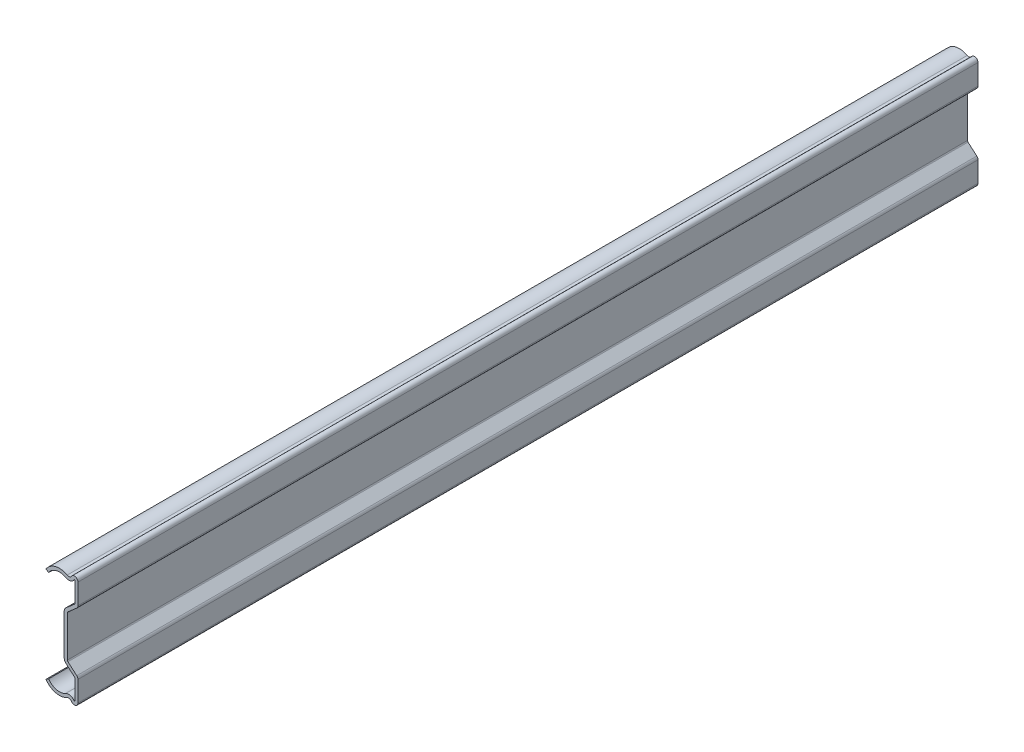
ISO-10303-21;
HEADER;
FILE_DESCRIPTION(('STEP AP214'),'2;1');
FILE_NAME('part.step','',(''),(''),'','','');
FILE_SCHEMA(('AUTOMOTIVE_DESIGN { 1 0 10303 214 1 1 1 1 }'));
ENDSEC;
DATA;
#1=APPLICATION_CONTEXT('core data for automotive mechanical design processes');
#2=APPLICATION_PROTOCOL_DEFINITION('international standard','automotive_design',2000,#1);
#3=PRODUCT_CONTEXT('',#1,'mechanical');
#4=PRODUCT('Part','Part','',(#3));
#5=PRODUCT_RELATED_PRODUCT_CATEGORY('part','',(#4));
#6=PRODUCT_DEFINITION_FORMATION('','',#4);
#7=PRODUCT_DEFINITION_CONTEXT('part definition',#1,'design');
#8=PRODUCT_DEFINITION('design','',#6,#7);
#9=PRODUCT_DEFINITION_SHAPE('','',#8);
#10=(LENGTH_UNIT() NAMED_UNIT(*) SI_UNIT(.MILLI.,.METRE.));
#11=(NAMED_UNIT(*) PLANE_ANGLE_UNIT() SI_UNIT($,.RADIAN.));
#12=(NAMED_UNIT(*) SI_UNIT($,.STERADIAN.) SOLID_ANGLE_UNIT());
#13=UNCERTAINTY_MEASURE_WITH_UNIT(LENGTH_MEASURE(1.E-05),#10,'distance_accuracy_value','');
#14=(GEOMETRIC_REPRESENTATION_CONTEXT(3) GLOBAL_UNCERTAINTY_ASSIGNED_CONTEXT((#13)) GLOBAL_UNIT_ASSIGNED_CONTEXT((#10,
#11,#12)) REPRESENTATION_CONTEXT('',''));
#15=CARTESIAN_POINT('',(0.,0.,0.));
#16=DIRECTION('',(0.,0.,1.));
#17=DIRECTION('',(1.,0.,0.));
#18=AXIS2_PLACEMENT_3D('',#15,#16,#17);
#19=CARTESIAN_POINT('',(-4.393139347672,-17.49300104292,-137.));
#20=DIRECTION('',(0.,0.,1.));
#21=DIRECTION('',(1.,0.,0.));
#22=AXIS2_PLACEMENT_3D('',#19,#20,#21);
#23=CYLINDRICAL_SURFACE('',#22,1.);
#24=CARTESIAN_POINT('',(-4.393139347672,-17.49300104292,145.));
#25=DIRECTION('',(0.,0.,1.));
#26=DIRECTION('',(1.,0.,0.));
#27=AXIS2_PLACEMENT_3D('',#24,#25,#26);
#28=CIRCLE('',#27,1.);
#29=CARTESIAN_POINT('',(-4.87936460593729,-16.619167535768,145.));
#30=VERTEX_POINT('',#29);
#31=CARTESIAN_POINT('',(-3.53926346782714,-16.972524355817,145.));
#32=VERTEX_POINT('',#31);
#33=EDGE_CURVE('E219',#30,#32,#28,.F.);
#34=ORIENTED_EDGE('',*,*,#33,.F.);
#35=DIRECTION('',(0.,0.,1.));
#36=VECTOR('',#35,1.);
#37=CARTESIAN_POINT('',(-4.87936460593715,-16.6191675357697,-137.));
#38=LINE('',#37,#36);
#39=CARTESIAN_POINT('',(-4.87936460593729,-16.619167535768,-137.));
#40=VERTEX_POINT('',#39);
#41=EDGE_CURVE('E221',#40,#30,#38,.T.);
#42=ORIENTED_EDGE('',*,*,#41,.F.);
#43=CARTESIAN_POINT('',(-4.393139347672,-17.49300104292,-137.));
#44=DIRECTION('',(0.,0.,1.));
#45=DIRECTION('',(1.,0.,0.));
#46=AXIS2_PLACEMENT_3D('',#43,#44,#45);
#47=CIRCLE('',#46,1.);
#48=CARTESIAN_POINT('',(-3.53926346782714,-16.972524355817,-137.));
#49=VERTEX_POINT('',#48);
#50=EDGE_CURVE('E21',#49,#40,#47,.T.);
#51=ORIENTED_EDGE('',*,*,#50,.F.);
#52=DIRECTION('',(0.,0.,1.));
#53=VECTOR('',#52,1.);
#54=CARTESIAN_POINT('',(-3.53926346782668,-16.9725243558192,-137.));
#55=LINE('',#54,#53);
#56=EDGE_CURVE('E314',#32,#49,#55,.F.);
#57=ORIENTED_EDGE('',*,*,#56,.F.);
#58=EDGE_LOOP('',(#34,#42,#51,#57));
#59=FACE_BOUND('',#58,.T.);
#60=ADVANCED_FACE('F17',(#59),#23,.F.);
#61=CARTESIAN_POINT('',(-2.6,-10.,-137.));
#62=DIRECTION('',(0.,0.,1.));
#63=DIRECTION('',(1.,0.,0.));
#64=AXIS2_PLACEMENT_3D('',#61,#62,#63);
#65=CYLINDRICAL_SURFACE('',#64,1.1);
#66=DIRECTION('',(0.,0.,-1.));
#67=VECTOR('',#66,1.);
#68=CARTESIAN_POINT('',(-1.5,-10.,-137.));
#69=LINE('',#68,#67);
#70=CARTESIAN_POINT('',(-1.5,-10.,-137.));
#71=VERTEX_POINT('',#70);
#72=CARTESIAN_POINT('',(-1.5,-10.,145.));
#73=VERTEX_POINT('',#72);
#74=EDGE_CURVE('E316',#71,#73,#69,.F.);
#75=ORIENTED_EDGE('',*,*,#74,.F.);
#76=CARTESIAN_POINT('',(-2.6,-10.,-137.));
#77=DIRECTION('',(0.,0.,1.));
#78=DIRECTION('',(1.,0.,0.));
#79=AXIS2_PLACEMENT_3D('',#76,#77,#78);
#80=CIRCLE('',#79,1.1);
#81=CARTESIAN_POINT('',(-1.87795841654408,-9.17014703003493,-137.));
#82=VERTEX_POINT('',#81);
#83=EDGE_CURVE('E307',#71,#82,#80,.T.);
#84=ORIENTED_EDGE('',*,*,#83,.T.);
#85=DIRECTION('',(0.,0.,1.));
#86=VECTOR('',#85,1.);
#87=CARTESIAN_POINT('',(-1.877958416544,-9.170147030035,-137.));
#88=LINE('',#87,#86);
#89=CARTESIAN_POINT('',(-1.87795841654408,-9.17014703003493,145.));
#90=VERTEX_POINT('',#89);
#91=EDGE_CURVE('E324',#90,#82,#88,.F.);
#92=ORIENTED_EDGE('',*,*,#91,.F.);
#93=CARTESIAN_POINT('',(-2.6,-10.,145.));
#94=DIRECTION('',(0.,0.,1.));
#95=DIRECTION('',(1.,0.,0.));
#96=AXIS2_PLACEMENT_3D('',#93,#94,#95);
#97=CIRCLE('',#96,1.1);
#98=EDGE_CURVE('E309',#90,#73,#97,.F.);
#99=ORIENTED_EDGE('',*,*,#98,.T.);
#100=EDGE_LOOP('',(#75,#84,#92,#99));
#101=FACE_BOUND('',#100,.T.);
#102=ADVANCED_FACE('F724',(#101),#65,.T.);
#103=CARTESIAN_POINT('',(-2.6,10.,-137.));
#104=DIRECTION('',(0.,0.,1.));
#105=DIRECTION('',(1.,0.,0.));
#106=AXIS2_PLACEMENT_3D('',#103,#104,#105);
#107=CYLINDRICAL_SURFACE('',#106,1.1);
#108=DIRECTION('',(0.,0.,1.));
#109=VECTOR('',#108,1.);
#110=CARTESIAN_POINT('',(-1.87795841654404,9.17014703003505,-137.));
#111=LINE('',#110,#109);
#112=CARTESIAN_POINT('',(-1.8779584165441,9.17014703003495,-137.));
#113=VERTEX_POINT('',#112);
#114=CARTESIAN_POINT('',(-1.8779584165441,9.17014703003495,145.));
#115=VERTEX_POINT('',#114);
#116=EDGE_CURVE('E434',#113,#115,#111,.T.);
#117=ORIENTED_EDGE('',*,*,#116,.F.);
#118=CARTESIAN_POINT('',(-2.6,10.,-137.));
#119=DIRECTION('',(0.,0.,1.));
#120=DIRECTION('',(1.,0.,0.));
#121=AXIS2_PLACEMENT_3D('',#118,#119,#120);
#122=CIRCLE('',#121,1.1);
#123=CARTESIAN_POINT('',(-1.5,10.,-137.));
#124=VERTEX_POINT('',#123);
#125=EDGE_CURVE('E303',#113,#124,#122,.T.);
#126=ORIENTED_EDGE('',*,*,#125,.T.);
#127=DIRECTION('',(0.,0.,-1.));
#128=VECTOR('',#127,1.);
#129=CARTESIAN_POINT('',(-1.5,10.,-137.));
#130=LINE('',#129,#128);
#131=CARTESIAN_POINT('',(-1.5,10.,145.));
#132=VERTEX_POINT('',#131);
#133=EDGE_CURVE('E431',#132,#124,#130,.T.);
#134=ORIENTED_EDGE('',*,*,#133,.F.);
#135=CARTESIAN_POINT('',(-2.6,10.,145.));
#136=DIRECTION('',(0.,0.,1.));
#137=DIRECTION('',(1.,0.,0.));
#138=AXIS2_PLACEMENT_3D('',#135,#136,#137);
#139=CIRCLE('',#138,1.1);
#140=EDGE_CURVE('E305',#132,#115,#139,.F.);
#141=ORIENTED_EDGE('',*,*,#140,.T.);
#142=EDGE_LOOP('',(#117,#126,#134,#141));
#143=FACE_BOUND('',#142,.T.);
#144=ADVANCED_FACE('F716',(#143),#107,.T.);
#145=CARTESIAN_POINT('',(-4.393139347672,17.49300104292,-137.));
#146=DIRECTION('',(0.,0.,1.));
#147=DIRECTION('',(1.,0.,0.));
#148=AXIS2_PLACEMENT_3D('',#145,#146,#147);
#149=CYLINDRICAL_SURFACE('',#148,1.);
#150=CARTESIAN_POINT('',(-4.393139347672,17.49300104292,145.));
#151=DIRECTION('',(0.,0.,1.));
#152=DIRECTION('',(1.,0.,0.));
#153=AXIS2_PLACEMENT_3D('',#150,#151,#152);
#154=CIRCLE('',#153,1.);
#155=CARTESIAN_POINT('',(-3.53926346782714,16.972524355817,145.));
#156=VERTEX_POINT('',#155);
#157=CARTESIAN_POINT('',(-4.87936460593729,16.619167535768,145.));
#158=VERTEX_POINT('',#157);
#159=EDGE_CURVE('E298',#156,#158,#154,.F.);
#160=ORIENTED_EDGE('',*,*,#159,.F.);
#161=DIRECTION('',(0.,0.,1.));
#162=VECTOR('',#161,1.);
#163=CARTESIAN_POINT('',(-3.53926346782668,16.9725243558192,-137.));
#164=LINE('',#163,#162);
#165=CARTESIAN_POINT('',(-3.53926346782714,16.972524355817,-137.));
#166=VERTEX_POINT('',#165);
#167=EDGE_CURVE('E428',#166,#156,#164,.T.);
#168=ORIENTED_EDGE('',*,*,#167,.F.);
#169=CARTESIAN_POINT('',(-4.393139347672,17.49300104292,-137.));
#170=DIRECTION('',(0.,0.,1.));
#171=DIRECTION('',(1.,0.,0.));
#172=AXIS2_PLACEMENT_3D('',#169,#170,#171);
#173=CIRCLE('',#172,1.);
#174=CARTESIAN_POINT('',(-4.87936460593729,16.619167535768,-137.));
#175=VERTEX_POINT('',#174);
#176=EDGE_CURVE('E301',#175,#166,#173,.T.);
#177=ORIENTED_EDGE('',*,*,#176,.F.);
#178=DIRECTION('',(0.,0.,1.));
#179=VECTOR('',#178,1.);
#180=CARTESIAN_POINT('',(-4.87936460593715,16.6191675357697,-137.));
#181=LINE('',#180,#179);
#182=EDGE_CURVE('E419',#158,#175,#181,.F.);
#183=ORIENTED_EDGE('',*,*,#182,.F.);
#184=EDGE_LOOP('',(#160,#168,#177,#183));
#185=FACE_BOUND('',#184,.T.);
#186=ADVANCED_FACE('F708',(#185),#149,.F.);
#187=CARTESIAN_POINT('',(-11.51049089726,14.96293199325,-137.));
#188=DIRECTION('',(-0.542586398650006,-0.84000000000001,0.));
#189=DIRECTION('',(0.84000000000001,-0.542586398650006,0.));
#190=AXIS2_PLACEMENT_3D('',#187,#188,#189);
#191=PLANE('',#190);
#192=DIRECTION('',(0.,0.,1.));
#193=VECTOR('',#192,1.);
#194=CARTESIAN_POINT('',(-11.5104908972622,14.9629319932514,-137.));
#195=LINE('',#194,#193);
#196=CARTESIAN_POINT('',(-11.5104908972622,14.9629319932514,-137.));
#197=VERTEX_POINT('',#196);
#198=CARTESIAN_POINT('',(-11.5104908972622,14.9629319932514,145.));
#199=VERTEX_POINT('',#198);
#200=EDGE_CURVE('E422',#197,#199,#195,.T.);
#201=ORIENTED_EDGE('',*,*,#200,.F.);
#202=DIRECTION('',(0.84000000000001,-0.542586398650006,0.));
#203=VECTOR('',#202,1.);
#204=CARTESIAN_POINT('',(-11.51049089726,14.96293199325,-137.));
#205=LINE('',#204,#203);
#206=CARTESIAN_POINT('',(-10.6704908972622,14.4203455946014,-137.));
#207=VERTEX_POINT('',#206);
#208=EDGE_CURVE('E297',#197,#207,#205,.T.);
#209=ORIENTED_EDGE('',*,*,#208,.T.);
#210=DIRECTION('',(0.,0.,1.));
#211=VECTOR('',#210,1.);
#212=CARTESIAN_POINT('',(-10.6704908972622,14.4203455946014,-137.));
#213=LINE('',#212,#211);
#214=CARTESIAN_POINT('',(-10.6704908972622,14.4203455946014,145.));
#215=VERTEX_POINT('',#214);
#216=EDGE_CURVE('E416',#207,#215,#213,.T.);
#217=ORIENTED_EDGE('',*,*,#216,.T.);
#218=DIRECTION('',(0.84000000000001,-0.542586398650006,0.));
#219=VECTOR('',#218,1.);
#220=CARTESIAN_POINT('',(-11.51049089726,14.96293199325,145.));
#221=LINE('',#220,#219);
#222=EDGE_CURVE('E300',#215,#199,#221,.F.);
#223=ORIENTED_EDGE('',*,*,#222,.T.);
#224=EDGE_LOOP('',(#201,#209,#217,#223));
#225=FACE_BOUND('',#224,.T.);
#226=ADVANCED_FACE('F700',(#225),#191,.T.);
#227=CARTESIAN_POINT('',(-2.6,16.4,-137.));
#228=DIRECTION('',(0.,0.,1.));
#229=DIRECTION('',(1.,0.,0.));
#230=AXIS2_PLACEMENT_3D('',#227,#228,#229);
#231=CYLINDRICAL_SURFACE('',#230,0.1);
#232=CARTESIAN_POINT('',(-2.6,16.4,145.));
#233=DIRECTION('',(0.,0.,1.));
#234=DIRECTION('',(1.,0.,0.));
#235=AXIS2_PLACEMENT_3D('',#232,#233,#234);
#236=CIRCLE('',#235,0.1);
#237=CARTESIAN_POINT('',(-2.68538758798386,16.45204766871,145.));
#238=VERTEX_POINT('',#237);
#239=CARTESIAN_POINT('',(-2.5,16.4,145.));
#240=VERTEX_POINT('',#239);
#241=EDGE_CURVE('E293',#238,#240,#236,.F.);
#242=ORIENTED_EDGE('',*,*,#241,.F.);
#243=DIRECTION('',(0.,0.,1.));
#244=VECTOR('',#243,1.);
#245=CARTESIAN_POINT('',(-2.68538758798328,16.4520476687096,-137.));
#246=LINE('',#245,#244);
#247=CARTESIAN_POINT('',(-2.68538758798386,16.45204766871,-137.));
#248=VERTEX_POINT('',#247);
#249=EDGE_CURVE('E413',#248,#238,#246,.T.);
#250=ORIENTED_EDGE('',*,*,#249,.F.);
#251=CARTESIAN_POINT('',(-2.6,16.4,-137.));
#252=DIRECTION('',(0.,0.,1.));
#253=DIRECTION('',(1.,0.,0.));
#254=AXIS2_PLACEMENT_3D('',#251,#252,#253);
#255=CIRCLE('',#254,0.1);
#256=CARTESIAN_POINT('',(-2.5,16.4,-137.));
#257=VERTEX_POINT('',#256);
#258=EDGE_CURVE('E295',#257,#248,#255,.T.);
#259=ORIENTED_EDGE('',*,*,#258,.F.);
#260=DIRECTION('',(0.,0.,1.));
#261=VECTOR('',#260,1.);
#262=CARTESIAN_POINT('',(-2.5,16.4,-137.));
#263=LINE('',#262,#261);
#264=EDGE_CURVE('E404',#240,#257,#263,.F.);
#265=ORIENTED_EDGE('',*,*,#264,.F.);
#266=EDGE_LOOP('',(#242,#250,#259,#265));
#267=FACE_BOUND('',#266,.T.);
#268=ADVANCED_FACE('F692',(#267),#231,.F.);
#269=CARTESIAN_POINT('',(-2.6,10.,-137.));
#270=DIRECTION('',(0.,0.,1.));
#271=DIRECTION('',(1.,0.,0.));
#272=AXIS2_PLACEMENT_3D('',#269,#270,#271);
#273=CYLINDRICAL_SURFACE('',#272,0.1);
#274=CARTESIAN_POINT('',(-2.6,10.,145.));
#275=DIRECTION('',(0.,0.,1.));
#276=DIRECTION('',(1.,0.,0.));
#277=AXIS2_PLACEMENT_3D('',#274,#275,#276);
#278=CIRCLE('',#277,0.1);
#279=CARTESIAN_POINT('',(-2.5,10.,145.));
#280=VERTEX_POINT('',#279);
#281=CARTESIAN_POINT('',(-2.53435985604907,9.92455882091194,145.));
#282=VERTEX_POINT('',#281);
#283=EDGE_CURVE('E289',#280,#282,#278,.F.);
#284=ORIENTED_EDGE('',*,*,#283,.F.);
#285=DIRECTION('',(0.,0.,1.));
#286=VECTOR('',#285,1.);
#287=CARTESIAN_POINT('',(-2.5,10.,-137.));
#288=LINE('',#287,#286);
#289=CARTESIAN_POINT('',(-2.5,10.,-137.));
#290=VERTEX_POINT('',#289);
#291=EDGE_CURVE('E407',#290,#280,#288,.T.);
#292=ORIENTED_EDGE('',*,*,#291,.F.);
#293=CARTESIAN_POINT('',(-2.6,10.,-137.));
#294=DIRECTION('',(0.,0.,1.));
#295=DIRECTION('',(1.,0.,0.));
#296=AXIS2_PLACEMENT_3D('',#293,#294,#295);
#297=CIRCLE('',#296,0.1);
#298=CARTESIAN_POINT('',(-2.53435985604907,9.92455882091194,-137.));
#299=VERTEX_POINT('',#298);
#300=EDGE_CURVE('E291',#299,#290,#297,.T.);
#301=ORIENTED_EDGE('',*,*,#300,.F.);
#302=DIRECTION('',(0.,0.,1.));
#303=VECTOR('',#302,1.);
#304=CARTESIAN_POINT('',(-2.534359856049,9.924558820912,-137.));
#305=LINE('',#304,#303);
#306=EDGE_CURVE('E398',#282,#299,#305,.F.);
#307=ORIENTED_EDGE('',*,*,#306,.F.);
#308=EDGE_LOOP('',(#284,#292,#301,#307));
#309=FACE_BOUND('',#308,.T.);
#310=ADVANCED_FACE('F684',(#309),#273,.F.);
#311=CARTESIAN_POINT('',(-4.3,6.4,-137.));
#312=DIRECTION('',(0.,0.,1.));
#313=DIRECTION('',(1.,0.,0.));
#314=AXIS2_PLACEMENT_3D('',#311,#312,#313);
#315=CYLINDRICAL_SURFACE('',#314,1.5);
#316=DIRECTION('',(0.,0.,1.));
#317=VECTOR('',#316,1.);
#318=CARTESIAN_POINT('',(-5.28460215925796,7.53161768631595,-137.));
#319=LINE('',#318,#317);
#320=CARTESIAN_POINT('',(-5.28460215925794,7.53161768631601,-137.));
#321=VERTEX_POINT('',#320);
#322=CARTESIAN_POINT('',(-5.28460215925794,7.53161768631601,145.));
#323=VERTEX_POINT('',#322);
#324=EDGE_CURVE('E401',#321,#323,#319,.T.);
#325=ORIENTED_EDGE('',*,*,#324,.F.);
#326=CARTESIAN_POINT('',(-4.3,6.4,-137.));
#327=DIRECTION('',(0.,0.,1.));
#328=DIRECTION('',(1.,0.,0.));
#329=AXIS2_PLACEMENT_3D('',#326,#327,#328);
#330=CIRCLE('',#329,1.5);
#331=CARTESIAN_POINT('',(-5.8,6.4,-137.));
#332=VERTEX_POINT('',#331);
#333=EDGE_CURVE('E285',#321,#332,#330,.T.);
#334=ORIENTED_EDGE('',*,*,#333,.T.);
#335=DIRECTION('',(0.,0.,1.));
#336=VECTOR('',#335,1.);
#337=CARTESIAN_POINT('',(-5.8,6.4,-137.));
#338=LINE('',#337,#336);
#339=CARTESIAN_POINT('',(-5.8,6.4,145.));
#340=VERTEX_POINT('',#339);
#341=EDGE_CURVE('E392',#340,#332,#338,.F.);
#342=ORIENTED_EDGE('',*,*,#341,.F.);
#343=CARTESIAN_POINT('',(-4.3,6.4,145.));
#344=DIRECTION('',(0.,0.,1.));
#345=DIRECTION('',(1.,0.,0.));
#346=AXIS2_PLACEMENT_3D('',#343,#344,#345);
#347=CIRCLE('',#346,1.5);
#348=EDGE_CURVE('E287',#340,#323,#347,.F.);
#349=ORIENTED_EDGE('',*,*,#348,.T.);
#350=EDGE_LOOP('',(#325,#334,#342,#349));
#351=FACE_BOUND('',#350,.T.);
#352=ADVANCED_FACE('F676',(#351),#315,.T.);
#353=CARTESIAN_POINT('',(-4.3,-6.4,-137.));
#354=DIRECTION('',(0.,0.,1.));
#355=DIRECTION('',(1.,0.,0.));
#356=AXIS2_PLACEMENT_3D('',#353,#354,#355);
#357=CYLINDRICAL_SURFACE('',#356,1.5);
#358=DIRECTION('',(0.,0.,1.));
#359=VECTOR('',#358,1.);
#360=CARTESIAN_POINT('',(-5.8,-6.4,-137.));
#361=LINE('',#360,#359);
#362=CARTESIAN_POINT('',(-5.8,-6.4,-137.));
#363=VERTEX_POINT('',#362);
#364=CARTESIAN_POINT('',(-5.8,-6.4,145.));
#365=VERTEX_POINT('',#364);
#366=EDGE_CURVE('E395',#363,#365,#361,.T.);
#367=ORIENTED_EDGE('',*,*,#366,.F.);
#368=CARTESIAN_POINT('',(-4.3,-6.4,-137.));
#369=DIRECTION('',(0.,0.,1.));
#370=DIRECTION('',(1.,0.,0.));
#371=AXIS2_PLACEMENT_3D('',#368,#369,#370);
#372=CIRCLE('',#371,1.5);
#373=CARTESIAN_POINT('',(-5.28460215925806,-7.53161768631594,-137.));
#374=VERTEX_POINT('',#373);
#375=EDGE_CURVE('E281',#363,#374,#372,.T.);
#376=ORIENTED_EDGE('',*,*,#375,.T.);
#377=DIRECTION('',(0.,0.,1.));
#378=VECTOR('',#377,1.);
#379=CARTESIAN_POINT('',(-5.284602159258,-7.531617686316,-137.));
#380=LINE('',#379,#378);
#381=CARTESIAN_POINT('',(-5.28460215925806,-7.53161768631594,145.));
#382=VERTEX_POINT('',#381);
#383=EDGE_CURVE('E386',#382,#374,#380,.F.);
#384=ORIENTED_EDGE('',*,*,#383,.F.);
#385=CARTESIAN_POINT('',(-4.3,-6.4,145.));
#386=DIRECTION('',(0.,0.,1.));
#387=DIRECTION('',(1.,0.,0.));
#388=AXIS2_PLACEMENT_3D('',#385,#386,#387);
#389=CIRCLE('',#388,1.5);
#390=EDGE_CURVE('E283',#382,#365,#389,.F.);
#391=ORIENTED_EDGE('',*,*,#390,.T.);
#392=EDGE_LOOP('',(#367,#376,#384,#391));
#393=FACE_BOUND('',#392,.T.);
#394=ADVANCED_FACE('F668',(#393),#357,.T.);
#395=CARTESIAN_POINT('',(-2.6,-10.,-137.));
#396=DIRECTION('',(0.,0.,1.));
#397=DIRECTION('',(1.,0.,0.));
#398=AXIS2_PLACEMENT_3D('',#395,#396,#397);
#399=CYLINDRICAL_SURFACE('',#398,0.1);
#400=CARTESIAN_POINT('',(-2.6,-10.,145.));
#401=DIRECTION('',(0.,0.,1.));
#402=DIRECTION('',(1.,0.,0.));
#403=AXIS2_PLACEMENT_3D('',#400,#401,#402);
#404=CIRCLE('',#403,0.1);
#405=CARTESIAN_POINT('',(-2.53435985604958,-9.92455882091197,145.));
#406=VERTEX_POINT('',#405);
#407=CARTESIAN_POINT('',(-2.5,-10.,145.));
#408=VERTEX_POINT('',#407);
#409=EDGE_CURVE('E277',#406,#408,#404,.F.);
#410=ORIENTED_EDGE('',*,*,#409,.F.);
#411=DIRECTION('',(0.,0.,1.));
#412=VECTOR('',#411,1.);
#413=CARTESIAN_POINT('',(-2.53435985604961,-9.92455882091155,-137.));
#414=LINE('',#413,#412);
#415=CARTESIAN_POINT('',(-2.53435985604958,-9.92455882091197,-137.));
#416=VERTEX_POINT('',#415);
#417=EDGE_CURVE('E389',#416,#406,#414,.T.);
#418=ORIENTED_EDGE('',*,*,#417,.F.);
#419=CARTESIAN_POINT('',(-2.6,-10.,-137.));
#420=DIRECTION('',(0.,0.,1.));
#421=DIRECTION('',(1.,0.,0.));
#422=AXIS2_PLACEMENT_3D('',#419,#420,#421);
#423=CIRCLE('',#422,0.1);
#424=CARTESIAN_POINT('',(-2.5,-10.,-137.));
#425=VERTEX_POINT('',#424);
#426=EDGE_CURVE('E279',#425,#416,#423,.T.);
#427=ORIENTED_EDGE('',*,*,#426,.F.);
#428=DIRECTION('',(0.,0.,1.));
#429=VECTOR('',#428,1.);
#430=CARTESIAN_POINT('',(-2.5,-10.,-137.));
#431=LINE('',#430,#429);
#432=EDGE_CURVE('E380',#408,#425,#431,.F.);
#433=ORIENTED_EDGE('',*,*,#432,.F.);
#434=EDGE_LOOP('',(#410,#418,#427,#433));
#435=FACE_BOUND('',#434,.T.);
#436=ADVANCED_FACE('F660',(#435),#399,.F.);
#437=CARTESIAN_POINT('',(-2.6,-16.4,-137.));
#438=DIRECTION('',(0.,0.,1.));
#439=DIRECTION('',(1.,0.,0.));
#440=AXIS2_PLACEMENT_3D('',#437,#438,#439);
#441=CYLINDRICAL_SURFACE('',#440,0.1);
#442=CARTESIAN_POINT('',(-2.6,-16.4,145.));
#443=DIRECTION('',(0.,0.,1.));
#444=DIRECTION('',(1.,0.,0.));
#445=AXIS2_PLACEMENT_3D('',#442,#443,#444);
#446=CIRCLE('',#445,0.1);
#447=CARTESIAN_POINT('',(-2.5,-16.4,145.));
#448=VERTEX_POINT('',#447);
#449=CARTESIAN_POINT('',(-2.685387587984,-16.4520476687098,145.));
#450=VERTEX_POINT('',#449);
#451=EDGE_CURVE('E272',#448,#450,#446,.F.);
#452=ORIENTED_EDGE('',*,*,#451,.F.);
#453=DIRECTION('',(0.,0.,1.));
#454=VECTOR('',#453,1.);
#455=CARTESIAN_POINT('',(-2.5,-16.4,-137.));
#456=LINE('',#455,#454);
#457=CARTESIAN_POINT('',(-2.5,-16.4,-137.));
#458=VERTEX_POINT('',#457);
#459=EDGE_CURVE('E383',#458,#448,#456,.T.);
#460=ORIENTED_EDGE('',*,*,#459,.F.);
#461=CARTESIAN_POINT('',(-2.6,-16.4,-137.));
#462=DIRECTION('',(0.,0.,1.));
#463=DIRECTION('',(1.,0.,0.));
#464=AXIS2_PLACEMENT_3D('',#461,#462,#463);
#465=CIRCLE('',#464,0.1);
#466=CARTESIAN_POINT('',(-2.685387587984,-16.4520476687098,-137.));
#467=VERTEX_POINT('',#466);
#468=EDGE_CURVE('E275',#467,#458,#465,.T.);
#469=ORIENTED_EDGE('',*,*,#468,.F.);
#470=DIRECTION('',(0.,0.,1.));
#471=VECTOR('',#470,1.);
#472=CARTESIAN_POINT('',(-2.68538758798355,-16.4520476687091,-137.));
#473=LINE('',#472,#471);
#474=EDGE_CURVE('E377',#450,#467,#473,.F.);
#475=ORIENTED_EDGE('',*,*,#474,.F.);
#476=EDGE_LOOP('',(#452,#460,#469,#475));
#477=FACE_BOUND('',#476,.T.);
#478=ADVANCED_FACE('F652',(#477),#441,.F.);
#479=CARTESIAN_POINT('',(-10.67049089726,-14.4203455946,-137.));
#480=DIRECTION('',(-0.542586398650006,0.84000000000001,0.));
#481=DIRECTION('',(-0.84000000000001,-0.542586398650006,0.));
#482=AXIS2_PLACEMENT_3D('',#479,#480,#481);
#483=PLANE('',#482);
#484=DIRECTION('',(0.,0.,1.));
#485=VECTOR('',#484,1.);
#486=CARTESIAN_POINT('',(-10.6704908972622,-14.4203455946014,-137.));
#487=LINE('',#486,#485);
#488=CARTESIAN_POINT('',(-10.6704908972622,-14.4203455946014,145.));
#489=VERTEX_POINT('',#488);
#490=CARTESIAN_POINT('',(-10.6704908972622,-14.4203455946014,-137.));
#491=VERTEX_POINT('',#490);
#492=EDGE_CURVE('E372',#489,#491,#487,.F.);
#493=ORIENTED_EDGE('',*,*,#492,.T.);
#494=DIRECTION('',(-0.84000000000001,-0.542586398650006,0.));
#495=VECTOR('',#494,1.);
#496=CARTESIAN_POINT('',(-10.67049089726,-14.4203455946,-137.));
#497=LINE('',#496,#495);
#498=CARTESIAN_POINT('',(-11.5104908972622,-14.9629319932514,-137.));
#499=VERTEX_POINT('',#498);
#500=EDGE_CURVE('E226',#491,#499,#497,.T.);
#501=ORIENTED_EDGE('',*,*,#500,.T.);
#502=DIRECTION('',(0.,0.,1.));
#503=VECTOR('',#502,1.);
#504=CARTESIAN_POINT('',(-11.5104908972622,-14.9629319932514,-137.));
#505=LINE('',#504,#503);
#506=CARTESIAN_POINT('',(-11.5104908972622,-14.9629319932514,145.));
#507=VERTEX_POINT('',#506);
#508=EDGE_CURVE('E225',#507,#499,#505,.F.);
#509=ORIENTED_EDGE('',*,*,#508,.F.);
#510=DIRECTION('',(-0.84000000000001,-0.542586398650006,0.));
#511=VECTOR('',#510,1.);
#512=CARTESIAN_POINT('',(-10.67049089726,-14.4203455946,145.));
#513=LINE('',#512,#511);
#514=EDGE_CURVE('E274',#507,#489,#513,.F.);
#515=ORIENTED_EDGE('',*,*,#514,.T.);
#516=EDGE_LOOP('',(#493,#501,#509,#515));
#517=FACE_BOUND('',#516,.T.);
#518=ADVANCED_FACE('F645',(#517),#483,.T.);
#519=CARTESIAN_POINT('',(-7.310490897263,-12.25,-137.));
#520=DIRECTION('',(0.,0.,1.));
#521=DIRECTION('',(1.,0.,0.));
#522=AXIS2_PLACEMENT_3D('',#519,#520,#521);
#523=CYLINDRICAL_SURFACE('',#522,5.);
#524=ORIENTED_EDGE('',*,*,#508,.T.);
#525=CARTESIAN_POINT('',(-7.310490897263,-12.25,-137.));
#526=DIRECTION('',(0.,0.,1.));
#527=DIRECTION('',(1.,0.,0.));
#528=AXIS2_PLACEMENT_3D('',#525,#526,#527);
#529=CIRCLE('',#528,5.);
#530=EDGE_CURVE('E216',#499,#40,#529,.T.);
#531=ORIENTED_EDGE('',*,*,#530,.T.);
#532=ORIENTED_EDGE('',*,*,#41,.T.);
#533=CARTESIAN_POINT('',(-7.310490897263,-12.25,145.));
#534=DIRECTION('',(0.,0.,1.));
#535=DIRECTION('',(1.,0.,0.));
#536=AXIS2_PLACEMENT_3D('',#533,#534,#535);
#537=CIRCLE('',#536,5.);
#538=EDGE_CURVE('E239',#507,#30,#537,.T.);
#539=ORIENTED_EDGE('',*,*,#538,.F.);
#540=EDGE_LOOP('',(#524,#531,#532,#539));
#541=FACE_BOUND('',#540,.T.);
#542=ADVANCED_FACE('F229',(#541),#523,.T.);
#543=CARTESIAN_POINT('',(-2.6,-16.4,-137.));
#544=DIRECTION('',(0.,0.,1.));
#545=DIRECTION('',(1.,0.,0.));
#546=AXIS2_PLACEMENT_3D('',#543,#544,#545);
#547=CYLINDRICAL_SURFACE('',#546,1.1);
#548=ORIENTED_EDGE('',*,*,#56,.T.);
#549=CARTESIAN_POINT('',(-2.6,-16.4,-137.));
#550=DIRECTION('',(0.,0.,1.));
#551=DIRECTION('',(1.,0.,0.));
#552=AXIS2_PLACEMENT_3D('',#549,#550,#551);
#553=CIRCLE('',#552,1.1);
#554=CARTESIAN_POINT('',(-1.5,-16.4,-137.));
#555=VERTEX_POINT('',#554);
#556=EDGE_CURVE('E218',#49,#555,#553,.T.);
#557=ORIENTED_EDGE('',*,*,#556,.T.);
#558=DIRECTION('',(0.,0.,-1.));
#559=VECTOR('',#558,1.);
#560=CARTESIAN_POINT('',(-1.5,-16.4,-137.));
#561=LINE('',#560,#559);
#562=CARTESIAN_POINT('',(-1.5,-16.4,145.));
#563=VERTEX_POINT('',#562);
#564=EDGE_CURVE('E320',#563,#555,#561,.T.);
#565=ORIENTED_EDGE('',*,*,#564,.F.);
#566=CARTESIAN_POINT('',(-2.6,-16.4,145.));
#567=DIRECTION('',(0.,0.,1.));
#568=DIRECTION('',(1.,0.,0.));
#569=AXIS2_PLACEMENT_3D('',#566,#567,#568);
#570=CIRCLE('',#569,1.1);
#571=EDGE_CURVE('E267',#32,#563,#570,.T.);
#572=ORIENTED_EDGE('',*,*,#571,.F.);
#573=EDGE_LOOP('',(#548,#557,#565,#572));
#574=FACE_BOUND('',#573,.T.);
#575=ADVANCED_FACE('F318',(#574),#547,.T.);
#576=CARTESIAN_POINT('',(-1.5,-16.4,-137.));
#577=DIRECTION('',(1.,0.,0.));
#578=DIRECTION('',(0.,0.,-1.));
#579=AXIS2_PLACEMENT_3D('',#576,#577,#578);
#580=PLANE('',#579);
#581=ORIENTED_EDGE('',*,*,#564,.T.);
#582=DIRECTION('',(0.,1.,0.));
#583=VECTOR('',#582,1.);
#584=CARTESIAN_POINT('',(-1.5,0.,-137.));
#585=LINE('',#584,#583);
#586=EDGE_CURVE('E233',#555,#71,#585,.T.);
#587=ORIENTED_EDGE('',*,*,#586,.T.);
#588=ORIENTED_EDGE('',*,*,#74,.T.);
#589=DIRECTION('',(0.,1.,0.));
#590=VECTOR('',#589,1.);
#591=CARTESIAN_POINT('',(-1.5,0.,145.));
#592=LINE('',#591,#590);
#593=EDGE_CURVE('E270',#563,#73,#592,.T.);
#594=ORIENTED_EDGE('',*,*,#593,.F.);
#595=EDGE_LOOP('',(#581,#587,#588,#594));
#596=FACE_BOUND('',#595,.T.);
#597=ADVANCED_FACE('F327',(#596),#580,.T.);
#598=CARTESIAN_POINT('',(-1.877958416544,-9.170147030035,-137.));
#599=DIRECTION('',(0.656401439505487,0.754411790877585,0.));
#600=DIRECTION('',(-0.754411790877585,0.656401439505487,0.));
#601=AXIS2_PLACEMENT_3D('',#598,#599,#600);
#602=PLANE('',#601);
#603=ORIENTED_EDGE('',*,*,#91,.T.);
#604=DIRECTION('',(-0.754411790877596,0.656401439505473,0.));
#605=VECTOR('',#604,1.);
#606=CARTESIAN_POINT('',(-1.877958416544,-9.170147030035,-137.));
#607=LINE('',#606,#605);
#608=CARTESIAN_POINT('',(-4.62820071975287,-6.7772058954389,-137.));
#609=VERTEX_POINT('',#608);
#610=EDGE_CURVE('E359',#82,#609,#607,.T.);
#611=ORIENTED_EDGE('',*,*,#610,.T.);
#612=DIRECTION('',(0.,0.,1.));
#613=VECTOR('',#612,1.);
#614=CARTESIAN_POINT('',(-4.62820071975279,-6.77720589543875,-137.));
#615=LINE('',#614,#613);
#616=CARTESIAN_POINT('',(-4.62820071975287,-6.7772058954389,145.));
#617=VERTEX_POINT('',#616);
#618=EDGE_CURVE('E235',#609,#617,#615,.T.);
#619=ORIENTED_EDGE('',*,*,#618,.T.);
#620=DIRECTION('',(-0.754411790877596,0.656401439505473,0.));
#621=VECTOR('',#620,1.);
#622=CARTESIAN_POINT('',(-1.877958416544,-9.170147030035,145.));
#623=LINE('',#622,#621);
#624=EDGE_CURVE('E266',#90,#617,#623,.T.);
#625=ORIENTED_EDGE('',*,*,#624,.F.);
#626=EDGE_LOOP('',(#603,#611,#619,#625));
#627=FACE_BOUND('',#626,.T.);
#628=ADVANCED_FACE('F482',(#627),#602,.T.);
#629=CARTESIAN_POINT('',(-4.628200719753,6.777205895439,-137.));
#630=DIRECTION('',(0.656401439505487,-0.754411790877585,0.));
#631=DIRECTION('',(0.754411790877585,0.656401439505487,0.));
#632=AXIS2_PLACEMENT_3D('',#629,#630,#631);
#633=PLANE('',#632);
#634=DIRECTION('',(0.,0.,1.));
#635=VECTOR('',#634,1.);
#636=CARTESIAN_POINT('',(-4.62820071975279,6.77720589543875,-137.));
#637=LINE('',#636,#635);
#638=CARTESIAN_POINT('',(-4.62820071975287,6.7772058954389,145.));
#639=VERTEX_POINT('',#638);
#640=CARTESIAN_POINT('',(-4.62820071975287,6.7772058954389,-137.));
#641=VERTEX_POINT('',#640);
#642=EDGE_CURVE('E271',#639,#641,#637,.F.);
#643=ORIENTED_EDGE('',*,*,#642,.T.);
#644=DIRECTION('',(0.754411790877596,0.656401439505473,0.));
#645=VECTOR('',#644,1.);
#646=CARTESIAN_POINT('',(-4.628200719753,6.777205895439,-137.));
#647=LINE('',#646,#645);
#648=EDGE_CURVE('E355',#641,#113,#647,.T.);
#649=ORIENTED_EDGE('',*,*,#648,.T.);
#650=ORIENTED_EDGE('',*,*,#116,.T.);
#651=DIRECTION('',(0.754411790877596,0.656401439505473,0.));
#652=VECTOR('',#651,1.);
#653=CARTESIAN_POINT('',(-4.628200719753,6.777205895439,145.));
#654=LINE('',#653,#652);
#655=EDGE_CURVE('E265',#639,#115,#654,.T.);
#656=ORIENTED_EDGE('',*,*,#655,.F.);
#657=EDGE_LOOP('',(#643,#649,#650,#656));
#658=FACE_BOUND('',#657,.T.);
#659=ADVANCED_FACE('F473',(#658),#633,.T.);
#660=CARTESIAN_POINT('',(-1.5,10.,-137.));
#661=DIRECTION('',(1.,0.,0.));
#662=DIRECTION('',(0.,0.,-1.));
#663=AXIS2_PLACEMENT_3D('',#660,#661,#662);
#664=PLANE('',#663);
#665=ORIENTED_EDGE('',*,*,#133,.T.);
#666=DIRECTION('',(0.,1.,0.));
#667=VECTOR('',#666,1.);
#668=CARTESIAN_POINT('',(-1.5,0.,-137.));
#669=LINE('',#668,#667);
#670=CARTESIAN_POINT('',(-1.5,16.4,-137.));
#671=VERTEX_POINT('',#670);
#672=EDGE_CURVE('E351',#124,#671,#669,.T.);
#673=ORIENTED_EDGE('',*,*,#672,.T.);
#674=DIRECTION('',(0.,0.,1.));
#675=VECTOR('',#674,1.);
#676=CARTESIAN_POINT('',(-1.5,16.4,-137.));
#677=LINE('',#676,#675);
#678=CARTESIAN_POINT('',(-1.5,16.4,145.));
#679=VERTEX_POINT('',#678);
#680=EDGE_CURVE('E425',#679,#671,#677,.F.);
#681=ORIENTED_EDGE('',*,*,#680,.F.);
#682=DIRECTION('',(0.,1.,0.));
#683=VECTOR('',#682,1.);
#684=CARTESIAN_POINT('',(-1.5,0.,145.));
#685=LINE('',#684,#683);
#686=EDGE_CURVE('E261',#132,#679,#685,.T.);
#687=ORIENTED_EDGE('',*,*,#686,.F.);
#688=EDGE_LOOP('',(#665,#673,#681,#687));
#689=FACE_BOUND('',#688,.T.);
#690=ADVANCED_FACE('F606',(#689),#664,.T.);
#691=CARTESIAN_POINT('',(-2.6,16.4,-137.));
#692=DIRECTION('',(0.,0.,1.));
#693=DIRECTION('',(1.,0.,0.));
#694=AXIS2_PLACEMENT_3D('',#691,#692,#693);
#695=CYLINDRICAL_SURFACE('',#694,1.1);
#696=ORIENTED_EDGE('',*,*,#680,.T.);
#697=CARTESIAN_POINT('',(-2.6,16.4,-137.));
#698=DIRECTION('',(0.,0.,1.));
#699=DIRECTION('',(1.,0.,0.));
#700=AXIS2_PLACEMENT_3D('',#697,#698,#699);
#701=CIRCLE('',#700,1.1);
#702=EDGE_CURVE('E354',#671,#166,#701,.T.);
#703=ORIENTED_EDGE('',*,*,#702,.T.);
#704=ORIENTED_EDGE('',*,*,#167,.T.);
#705=CARTESIAN_POINT('',(-2.6,16.4,145.));
#706=DIRECTION('',(0.,0.,1.));
#707=DIRECTION('',(1.,0.,0.));
#708=AXIS2_PLACEMENT_3D('',#705,#706,#707);
#709=CIRCLE('',#708,1.1);
#710=EDGE_CURVE('E258',#679,#156,#709,.T.);
#711=ORIENTED_EDGE('',*,*,#710,.F.);
#712=EDGE_LOOP('',(#696,#703,#704,#711));
#713=FACE_BOUND('',#712,.T.);
#714=ADVANCED_FACE('F598',(#713),#695,.T.);
#715=CARTESIAN_POINT('',(-7.310490897263,12.25,-137.));
#716=DIRECTION('',(0.,0.,1.));
#717=DIRECTION('',(1.,0.,0.));
#718=AXIS2_PLACEMENT_3D('',#715,#716,#717);
#719=CYLINDRICAL_SURFACE('',#718,5.);
#720=ORIENTED_EDGE('',*,*,#182,.T.);
#721=CARTESIAN_POINT('',(-7.310490897263,12.25,-137.));
#722=DIRECTION('',(0.,0.,1.));
#723=DIRECTION('',(1.,0.,0.));
#724=AXIS2_PLACEMENT_3D('',#721,#722,#723);
#725=CIRCLE('',#724,5.);
#726=EDGE_CURVE('E458',#175,#197,#725,.T.);
#727=ORIENTED_EDGE('',*,*,#726,.T.);
#728=ORIENTED_EDGE('',*,*,#200,.T.);
#729=CARTESIAN_POINT('',(-7.310490897263,12.25,145.));
#730=DIRECTION('',(0.,0.,1.));
#731=DIRECTION('',(1.,0.,0.));
#732=AXIS2_PLACEMENT_3D('',#729,#730,#731);
#733=CIRCLE('',#732,5.);
#734=EDGE_CURVE('E255',#158,#199,#733,.T.);
#735=ORIENTED_EDGE('',*,*,#734,.F.);
#736=EDGE_LOOP('',(#720,#727,#728,#735));
#737=FACE_BOUND('',#736,.T.);
#738=ADVANCED_FACE('F590',(#737),#719,.T.);
#739=CARTESIAN_POINT('',(-7.310490897263,12.25,-137.));
#740=DIRECTION('',(0.,0.,1.));
#741=DIRECTION('',(1.,0.,0.));
#742=AXIS2_PLACEMENT_3D('',#739,#740,#741);
#743=CYLINDRICAL_SURFACE('',#742,4.);
#744=CARTESIAN_POINT('',(-7.310490897263,12.25,145.));
#745=DIRECTION('',(0.,0.,1.));
#746=DIRECTION('',(1.,0.,0.));
#747=AXIS2_PLACEMENT_3D('',#744,#745,#746);
#748=CIRCLE('',#747,4.);
#749=CARTESIAN_POINT('',(-5.36558986420415,15.7453340286131,145.));
#750=VERTEX_POINT('',#749);
#751=EDGE_CURVE('E252',#215,#750,#748,.F.);
#752=ORIENTED_EDGE('',*,*,#751,.F.);
#753=ORIENTED_EDGE('',*,*,#216,.F.);
#754=CARTESIAN_POINT('',(-7.310490897263,12.25,-137.));
#755=DIRECTION('',(0.,0.,1.));
#756=DIRECTION('',(1.,0.,0.));
#757=AXIS2_PLACEMENT_3D('',#754,#755,#756);
#758=CIRCLE('',#757,4.);
#759=CARTESIAN_POINT('',(-5.36558986420336,15.7453340286145,-137.));
#760=VERTEX_POINT('',#759);
#761=EDGE_CURVE('E455',#207,#760,#758,.F.);
#762=ORIENTED_EDGE('',*,*,#761,.T.);
#763=DIRECTION('',(0.,0.,1.));
#764=VECTOR('',#763,1.);
#765=CARTESIAN_POINT('',(-5.36558986420544,15.7453340286138,-137.));
#766=LINE('',#765,#764);
#767=EDGE_CURVE('E410',#750,#760,#766,.F.);
#768=ORIENTED_EDGE('',*,*,#767,.F.);
#769=EDGE_LOOP('',(#752,#753,#762,#768));
#770=FACE_BOUND('',#769,.T.);
#771=ADVANCED_FACE('F582',(#770),#743,.F.);
#772=CARTESIAN_POINT('',(-4.393139347672,17.49300104292,-137.));
#773=DIRECTION('',(0.,0.,1.));
#774=DIRECTION('',(1.,0.,0.));
#775=AXIS2_PLACEMENT_3D('',#772,#773,#774);
#776=CYLINDRICAL_SURFACE('',#775,2.);
#777=ORIENTED_EDGE('',*,*,#767,.T.);
#778=CARTESIAN_POINT('',(-4.393139347672,17.49300104292,-137.));
#779=DIRECTION('',(0.,0.,1.));
#780=DIRECTION('',(1.,0.,0.));
#781=AXIS2_PLACEMENT_3D('',#778,#779,#780);
#782=CIRCLE('',#781,2.);
#783=EDGE_CURVE('E350',#760,#248,#782,.T.);
#784=ORIENTED_EDGE('',*,*,#783,.T.);
#785=ORIENTED_EDGE('',*,*,#249,.T.);
#786=CARTESIAN_POINT('',(-4.393139347672,17.49300104292,145.));
#787=DIRECTION('',(0.,0.,1.));
#788=DIRECTION('',(1.,0.,0.));
#789=AXIS2_PLACEMENT_3D('',#786,#787,#788);
#790=CIRCLE('',#789,2.);
#791=EDGE_CURVE('E248',#750,#238,#790,.T.);
#792=ORIENTED_EDGE('',*,*,#791,.F.);
#793=EDGE_LOOP('',(#777,#784,#785,#792));
#794=FACE_BOUND('',#793,.T.);
#795=ADVANCED_FACE('F574',(#794),#776,.T.);
#796=CARTESIAN_POINT('',(-2.5,16.4,-137.));
#797=DIRECTION('',(-1.,0.,0.));
#798=DIRECTION('',(0.,0.,1.));
#799=AXIS2_PLACEMENT_3D('',#796,#797,#798);
#800=PLANE('',#799);
#801=ORIENTED_EDGE('',*,*,#264,.T.);
#802=DIRECTION('',(0.,1.,0.));
#803=VECTOR('',#802,1.);
#804=CARTESIAN_POINT('',(-2.5,0.,-137.));
#805=LINE('',#804,#803);
#806=EDGE_CURVE('E347',#257,#290,#805,.F.);
#807=ORIENTED_EDGE('',*,*,#806,.T.);
#808=ORIENTED_EDGE('',*,*,#291,.T.);
#809=DIRECTION('',(0.,1.,0.));
#810=VECTOR('',#809,1.);
#811=CARTESIAN_POINT('',(-2.5,0.,145.));
#812=LINE('',#811,#810);
#813=EDGE_CURVE('E251',#240,#280,#812,.F.);
#814=ORIENTED_EDGE('',*,*,#813,.F.);
#815=EDGE_LOOP('',(#801,#807,#808,#814));
#816=FACE_BOUND('',#815,.T.);
#817=ADVANCED_FACE('F566',(#816),#800,.T.);
#818=CARTESIAN_POINT('',(-2.534359856049,9.924558820912,-137.));
#819=DIRECTION('',(-0.656401439505487,0.754411790877585,0.));
#820=DIRECTION('',(-0.754411790877585,-0.656401439505487,0.));
#821=AXIS2_PLACEMENT_3D('',#818,#819,#820);
#822=PLANE('',#821);
#823=ORIENTED_EDGE('',*,*,#306,.T.);
#824=DIRECTION('',(-0.754411790877596,-0.656401439505473,0.));
#825=VECTOR('',#824,1.);
#826=CARTESIAN_POINT('',(-2.534359856049,9.924558820912,-137.));
#827=LINE('',#826,#825);
#828=EDGE_CURVE('E344',#299,#321,#827,.T.);
#829=ORIENTED_EDGE('',*,*,#828,.T.);
#830=ORIENTED_EDGE('',*,*,#324,.T.);
#831=DIRECTION('',(-0.754411790877596,-0.656401439505473,0.));
#832=VECTOR('',#831,1.);
#833=CARTESIAN_POINT('',(-2.534359856049,9.924558820912,145.));
#834=LINE('',#833,#832);
#835=EDGE_CURVE('E748',#282,#323,#834,.T.);
#836=ORIENTED_EDGE('',*,*,#835,.F.);
#837=EDGE_LOOP('',(#823,#829,#830,#836));
#838=FACE_BOUND('',#837,.T.);
#839=ADVANCED_FACE('F558',(#838),#822,.T.);
#840=CARTESIAN_POINT('',(-5.8,6.4,-137.));
#841=DIRECTION('',(-1.,0.,0.));
#842=DIRECTION('',(0.,0.,1.));
#843=AXIS2_PLACEMENT_3D('',#840,#841,#842);
#844=PLANE('',#843);
#845=ORIENTED_EDGE('',*,*,#341,.T.);
#846=DIRECTION('',(0.,1.,0.));
#847=VECTOR('',#846,1.);
#848=CARTESIAN_POINT('',(-5.8,0.,-137.));
#849=LINE('',#848,#847);
#850=EDGE_CURVE('E341',#332,#363,#849,.F.);
#851=ORIENTED_EDGE('',*,*,#850,.T.);
#852=ORIENTED_EDGE('',*,*,#366,.T.);
#853=DIRECTION('',(0.,1.,0.));
#854=VECTOR('',#853,1.);
#855=CARTESIAN_POINT('',(-5.8,0.,145.));
#856=LINE('',#855,#854);
#857=EDGE_CURVE('E751',#340,#365,#856,.F.);
#858=ORIENTED_EDGE('',*,*,#857,.F.);
#859=EDGE_LOOP('',(#845,#851,#852,#858));
#860=FACE_BOUND('',#859,.T.);
#861=ADVANCED_FACE('F550',(#860),#844,.T.);
#862=CARTESIAN_POINT('',(-5.284602159258,-7.531617686316,-137.));
#863=DIRECTION('',(-0.656401439505487,-0.754411790877585,0.));
#864=DIRECTION('',(0.754411790877585,-0.656401439505487,0.));
#865=AXIS2_PLACEMENT_3D('',#862,#863,#864);
#866=PLANE('',#865);
#867=ORIENTED_EDGE('',*,*,#383,.T.);
#868=DIRECTION('',(0.754411790877478,-0.656401439505609,0.));
#869=VECTOR('',#868,1.);
#870=CARTESIAN_POINT('',(-5.284602159258,-7.531617686316,-137.));
#871=LINE('',#870,#869);
#872=EDGE_CURVE('E338',#374,#416,#871,.T.);
#873=ORIENTED_EDGE('',*,*,#872,.T.);
#874=ORIENTED_EDGE('',*,*,#417,.T.);
#875=DIRECTION('',(0.754411790877478,-0.656401439505609,0.));
#876=VECTOR('',#875,1.);
#877=CARTESIAN_POINT('',(-5.284602159258,-7.531617686316,145.));
#878=LINE('',#877,#876);
#879=EDGE_CURVE('E754',#382,#406,#878,.T.);
#880=ORIENTED_EDGE('',*,*,#879,.F.);
#881=EDGE_LOOP('',(#867,#873,#874,#880));
#882=FACE_BOUND('',#881,.T.);
#883=ADVANCED_FACE('F542',(#882),#866,.T.);
#884=CARTESIAN_POINT('',(-2.5,-10.,-137.));
#885=DIRECTION('',(-1.,0.,0.));
#886=DIRECTION('',(0.,0.,1.));
#887=AXIS2_PLACEMENT_3D('',#884,#885,#886);
#888=PLANE('',#887);
#889=ORIENTED_EDGE('',*,*,#432,.T.);
#890=DIRECTION('',(0.,1.,0.));
#891=VECTOR('',#890,1.);
#892=CARTESIAN_POINT('',(-2.5,0.,-137.));
#893=LINE('',#892,#891);
#894=EDGE_CURVE('E334',#425,#458,#893,.F.);
#895=ORIENTED_EDGE('',*,*,#894,.T.);
#896=ORIENTED_EDGE('',*,*,#459,.T.);
#897=DIRECTION('',(0.,1.,0.));
#898=VECTOR('',#897,1.);
#899=CARTESIAN_POINT('',(-2.5,0.,145.));
#900=LINE('',#899,#898);
#901=EDGE_CURVE('E247',#408,#448,#900,.F.);
#902=ORIENTED_EDGE('',*,*,#901,.F.);
#903=EDGE_LOOP('',(#889,#895,#896,#902));
#904=FACE_BOUND('',#903,.T.);
#905=ADVANCED_FACE('F534',(#904),#888,.T.);
#906=CARTESIAN_POINT('',(-4.393139347672,-17.49300104292,-137.));
#907=DIRECTION('',(0.,0.,1.));
#908=DIRECTION('',(1.,0.,0.));
#909=AXIS2_PLACEMENT_3D('',#906,#907,#908);
#910=CYLINDRICAL_SURFACE('',#909,2.);
#911=ORIENTED_EDGE('',*,*,#474,.T.);
#912=CARTESIAN_POINT('',(-4.393139347672,-17.49300104292,-137.));
#913=DIRECTION('',(0.,0.,1.));
#914=DIRECTION('',(1.,0.,0.));
#915=AXIS2_PLACEMENT_3D('',#912,#913,#914);
#916=CIRCLE('',#915,2.);
#917=CARTESIAN_POINT('',(-5.36558986420336,-15.7453340286145,-137.));
#918=VERTEX_POINT('',#917);
#919=EDGE_CURVE('E337',#467,#918,#916,.T.);
#920=ORIENTED_EDGE('',*,*,#919,.T.);
#921=DIRECTION('',(0.,0.,1.));
#922=VECTOR('',#921,1.);
#923=CARTESIAN_POINT('',(-5.36558986420386,-15.7453340286167,-137.));
#924=LINE('',#923,#922);
#925=CARTESIAN_POINT('',(-5.36558986420257,-15.7453340286159,145.));
#926=VERTEX_POINT('',#925);
#927=EDGE_CURVE('E375',#918,#926,#924,.T.);
#928=ORIENTED_EDGE('',*,*,#927,.T.);
#929=CARTESIAN_POINT('',(-4.393139347672,-17.49300104292,145.));
#930=DIRECTION('',(0.,0.,1.));
#931=DIRECTION('',(1.,0.,0.));
#932=AXIS2_PLACEMENT_3D('',#929,#930,#931);
#933=CIRCLE('',#932,2.);
#934=EDGE_CURVE('E244',#450,#926,#933,.T.);
#935=ORIENTED_EDGE('',*,*,#934,.F.);
#936=EDGE_LOOP('',(#911,#920,#928,#935));
#937=FACE_BOUND('',#936,.T.);
#938=ADVANCED_FACE('F526',(#937),#910,.T.);
#939=CARTESIAN_POINT('',(-7.310490897263,-12.25,-137.));
#940=DIRECTION('',(0.,0.,1.));
#941=DIRECTION('',(1.,0.,0.));
#942=AXIS2_PLACEMENT_3D('',#939,#940,#941);
#943=CYLINDRICAL_SURFACE('',#942,4.);
#944=CARTESIAN_POINT('',(-7.310490897263,-12.25,145.));
#945=DIRECTION('',(0.,0.,1.));
#946=DIRECTION('',(1.,0.,0.));
#947=AXIS2_PLACEMENT_3D('',#944,#945,#946);
#948=CIRCLE('',#947,4.);
#949=EDGE_CURVE('E241',#926,#489,#948,.F.);
#950=ORIENTED_EDGE('',*,*,#949,.F.);
#951=ORIENTED_EDGE('',*,*,#927,.F.);
#952=CARTESIAN_POINT('',(-7.310490897263,-12.25,-137.));
#953=DIRECTION('',(0.,0.,1.));
#954=DIRECTION('',(1.,0.,0.));
#955=AXIS2_PLACEMENT_3D('',#952,#953,#954);
#956=CIRCLE('',#955,4.);
#957=EDGE_CURVE('E369',#918,#491,#956,.F.);
#958=ORIENTED_EDGE('',*,*,#957,.T.);
#959=ORIENTED_EDGE('',*,*,#492,.F.);
#960=EDGE_LOOP('',(#950,#951,#958,#959));
#961=FACE_BOUND('',#960,.T.);
#962=ADVANCED_FACE('F519',(#961),#943,.F.);
#963=CARTESIAN_POINT('',(-4.3,6.4,-137.));
#964=DIRECTION('',(0.,0.,1.));
#965=DIRECTION('',(1.,0.,0.));
#966=AXIS2_PLACEMENT_3D('',#963,#964,#965);
#967=CYLINDRICAL_SURFACE('',#966,0.5);
#968=CARTESIAN_POINT('',(-4.3,6.4,145.));
#969=DIRECTION('',(0.,0.,1.));
#970=DIRECTION('',(1.,0.,0.));
#971=AXIS2_PLACEMENT_3D('',#968,#969,#970);
#972=CIRCLE('',#971,0.5);
#973=CARTESIAN_POINT('',(-4.8,6.4,145.));
#974=VERTEX_POINT('',#973);
#975=EDGE_CURVE('E262',#974,#639,#972,.F.);
#976=ORIENTED_EDGE('',*,*,#975,.F.);
#977=DIRECTION('',(0.,0.,-1.));
#978=VECTOR('',#977,1.);
#979=CARTESIAN_POINT('',(-4.8,6.4,-137.));
#980=LINE('',#979,#978);
#981=CARTESIAN_POINT('',(-4.8,6.4,-137.));
#982=VERTEX_POINT('',#981);
#983=EDGE_CURVE('E366',#982,#974,#980,.F.);
#984=ORIENTED_EDGE('',*,*,#983,.F.);
#985=CARTESIAN_POINT('',(-4.3,6.4,-137.));
#986=DIRECTION('',(0.,0.,1.));
#987=DIRECTION('',(1.,0.,0.));
#988=AXIS2_PLACEMENT_3D('',#985,#986,#987);
#989=CIRCLE('',#988,0.5);
#990=EDGE_CURVE('E358',#982,#641,#989,.F.);
#991=ORIENTED_EDGE('',*,*,#990,.T.);
#992=ORIENTED_EDGE('',*,*,#642,.F.);
#993=EDGE_LOOP('',(#976,#984,#991,#992));
#994=FACE_BOUND('',#993,.T.);
#995=ADVANCED_FACE('F468',(#994),#967,.F.);
#996=CARTESIAN_POINT('',(0.,0.,145.));
#997=DIRECTION('',(0.,0.,1.));
#998=DIRECTION('',(1.,0.,0.));
#999=AXIS2_PLACEMENT_3D('',#996,#997,#998);
#1000=PLANE('',#999);
#1001=ORIENTED_EDGE('',*,*,#514,.F.);
#1002=ORIENTED_EDGE('',*,*,#538,.T.);
#1003=ORIENTED_EDGE('',*,*,#33,.T.);
#1004=ORIENTED_EDGE('',*,*,#571,.T.);
#1005=ORIENTED_EDGE('',*,*,#593,.T.);
#1006=ORIENTED_EDGE('',*,*,#98,.F.);
#1007=ORIENTED_EDGE('',*,*,#624,.T.);
#1008=CARTESIAN_POINT('',(-4.3,-6.4,145.));
#1009=DIRECTION('',(0.,0.,1.));
#1010=DIRECTION('',(1.,0.,0.));
#1011=AXIS2_PLACEMENT_3D('',#1008,#1009,#1010);
#1012=CIRCLE('',#1011,0.5);
#1013=CARTESIAN_POINT('',(-4.8,-6.4,145.));
#1014=VERTEX_POINT('',#1013);
#1015=EDGE_CURVE('E231',#617,#1014,#1012,.F.);
#1016=ORIENTED_EDGE('',*,*,#1015,.T.);
#1017=DIRECTION('',(0.,1.,0.));
#1018=VECTOR('',#1017,1.);
#1019=CARTESIAN_POINT('',(-4.8,-6.4,145.));
#1020=LINE('',#1019,#1018);
#1021=EDGE_CURVE('E364',#974,#1014,#1020,.F.);
#1022=ORIENTED_EDGE('',*,*,#1021,.F.);
#1023=ORIENTED_EDGE('',*,*,#975,.T.);
#1024=ORIENTED_EDGE('',*,*,#655,.T.);
#1025=ORIENTED_EDGE('',*,*,#140,.F.);
#1026=ORIENTED_EDGE('',*,*,#686,.T.);
#1027=ORIENTED_EDGE('',*,*,#710,.T.);
#1028=ORIENTED_EDGE('',*,*,#159,.T.);
#1029=ORIENTED_EDGE('',*,*,#734,.T.);
#1030=ORIENTED_EDGE('',*,*,#222,.F.);
#1031=ORIENTED_EDGE('',*,*,#751,.T.);
#1032=ORIENTED_EDGE('',*,*,#791,.T.);
#1033=ORIENTED_EDGE('',*,*,#241,.T.);
#1034=ORIENTED_EDGE('',*,*,#813,.T.);
#1035=ORIENTED_EDGE('',*,*,#283,.T.);
#1036=ORIENTED_EDGE('',*,*,#835,.T.);
#1037=ORIENTED_EDGE('',*,*,#348,.F.);
#1038=ORIENTED_EDGE('',*,*,#857,.T.);
#1039=ORIENTED_EDGE('',*,*,#390,.F.);
#1040=ORIENTED_EDGE('',*,*,#879,.T.);
#1041=ORIENTED_EDGE('',*,*,#409,.T.);
#1042=ORIENTED_EDGE('',*,*,#901,.T.);
#1043=ORIENTED_EDGE('',*,*,#451,.T.);
#1044=ORIENTED_EDGE('',*,*,#934,.T.);
#1045=ORIENTED_EDGE('',*,*,#949,.T.);
#1046=EDGE_LOOP('',(#1001,#1002,#1003,#1004,#1005,#1006,#1007,#1016,#1022,#1023,#1024,#1025,
#1026,#1027,#1028,#1029,#1030,#1031,#1032,#1033,#1034,#1035,#1036,#1037,#1038,#1039,#1040,#1041,
#1042,#1043,#1044,#1045));
#1047=FACE_BOUND('',#1046,.T.);
#1048=ADVANCED_FACE('F311',(#1047),#1000,.T.);
#1049=CARTESIAN_POINT('',(-4.3,-6.4,-137.));
#1050=DIRECTION('',(0.,0.,1.));
#1051=DIRECTION('',(1.,0.,0.));
#1052=AXIS2_PLACEMENT_3D('',#1049,#1050,#1051);
#1053=CYLINDRICAL_SURFACE('',#1052,0.5);
#1054=ORIENTED_EDGE('',*,*,#1015,.F.);
#1055=ORIENTED_EDGE('',*,*,#618,.F.);
#1056=CARTESIAN_POINT('',(-4.3,-6.4,-137.));
#1057=DIRECTION('',(0.,0.,1.));
#1058=DIRECTION('',(1.,0.,0.));
#1059=AXIS2_PLACEMENT_3D('',#1056,#1057,#1058);
#1060=CIRCLE('',#1059,0.5);
#1061=CARTESIAN_POINT('',(-4.8,-6.4,-137.));
#1062=VERTEX_POINT('',#1061);
#1063=EDGE_CURVE('E36',#609,#1062,#1060,.F.);
#1064=ORIENTED_EDGE('',*,*,#1063,.T.);
#1065=DIRECTION('',(0.,0.,-1.));
#1066=VECTOR('',#1065,1.);
#1067=CARTESIAN_POINT('',(-4.8,-6.4,-137.));
#1068=LINE('',#1067,#1066);
#1069=EDGE_CURVE('E27',#1014,#1062,#1068,.T.);
#1070=ORIENTED_EDGE('',*,*,#1069,.F.);
#1071=EDGE_LOOP('',(#1054,#1055,#1064,#1070));
#1072=FACE_BOUND('',#1071,.T.);
#1073=ADVANCED_FACE('F485',(#1072),#1053,.F.);
#1074=CARTESIAN_POINT('',(0.,0.,-137.));
#1075=DIRECTION('',(0.,0.,1.));
#1076=DIRECTION('',(1.,0.,0.));
#1077=AXIS2_PLACEMENT_3D('',#1074,#1075,#1076);
#1078=PLANE('',#1077);
#1079=ORIENTED_EDGE('',*,*,#957,.F.);
#1080=ORIENTED_EDGE('',*,*,#919,.F.);
#1081=ORIENTED_EDGE('',*,*,#468,.T.);
#1082=ORIENTED_EDGE('',*,*,#894,.F.);
#1083=ORIENTED_EDGE('',*,*,#426,.T.);
#1084=ORIENTED_EDGE('',*,*,#872,.F.);
#1085=ORIENTED_EDGE('',*,*,#375,.F.);
#1086=ORIENTED_EDGE('',*,*,#850,.F.);
#1087=ORIENTED_EDGE('',*,*,#333,.F.);
#1088=ORIENTED_EDGE('',*,*,#828,.F.);
#1089=ORIENTED_EDGE('',*,*,#300,.T.);
#1090=ORIENTED_EDGE('',*,*,#806,.F.);
#1091=ORIENTED_EDGE('',*,*,#258,.T.);
#1092=ORIENTED_EDGE('',*,*,#783,.F.);
#1093=ORIENTED_EDGE('',*,*,#761,.F.);
#1094=ORIENTED_EDGE('',*,*,#208,.F.);
#1095=ORIENTED_EDGE('',*,*,#726,.F.);
#1096=ORIENTED_EDGE('',*,*,#176,.T.);
#1097=ORIENTED_EDGE('',*,*,#702,.F.);
#1098=ORIENTED_EDGE('',*,*,#672,.F.);
#1099=ORIENTED_EDGE('',*,*,#125,.F.);
#1100=ORIENTED_EDGE('',*,*,#648,.F.);
#1101=ORIENTED_EDGE('',*,*,#990,.F.);
#1102=DIRECTION('',(0.,1.,0.));
#1103=VECTOR('',#1102,1.);
#1104=CARTESIAN_POINT('',(-4.8,-6.4,-137.));
#1105=LINE('',#1104,#1103);
#1106=EDGE_CURVE('E11',#1062,#982,#1105,.T.);
#1107=ORIENTED_EDGE('',*,*,#1106,.F.);
#1108=ORIENTED_EDGE('',*,*,#1063,.F.);
#1109=ORIENTED_EDGE('',*,*,#610,.F.);
#1110=ORIENTED_EDGE('',*,*,#83,.F.);
#1111=ORIENTED_EDGE('',*,*,#586,.F.);
#1112=ORIENTED_EDGE('',*,*,#556,.F.);
#1113=ORIENTED_EDGE('',*,*,#50,.T.);
#1114=ORIENTED_EDGE('',*,*,#530,.F.);
#1115=ORIENTED_EDGE('',*,*,#500,.F.);
#1116=EDGE_LOOP('',(#1079,#1080,#1081,#1082,#1083,#1084,#1085,#1086,#1087,#1088,#1089,#1090,
#1091,#1092,#1093,#1094,#1095,#1096,#1097,#1098,#1099,#1100,#1101,#1107,#1108,#1109,#1110,#1111,
#1112,#1113,#1114,#1115));
#1117=FACE_BOUND('',#1116,.T.);
#1118=ADVANCED_FACE('F213',(#1117),#1078,.F.);
#1119=CARTESIAN_POINT('',(-4.8,-6.4,-137.));
#1120=DIRECTION('',(1.,0.,0.));
#1121=DIRECTION('',(0.,0.,-1.));
#1122=AXIS2_PLACEMENT_3D('',#1119,#1120,#1121);
#1123=PLANE('',#1122);
#1124=ORIENTED_EDGE('',*,*,#1069,.T.);
#1125=ORIENTED_EDGE('',*,*,#1106,.T.);
#1126=ORIENTED_EDGE('',*,*,#983,.T.);
#1127=ORIENTED_EDGE('',*,*,#1021,.T.);
#1128=EDGE_LOOP('',(#1124,#1125,#1126,#1127));
#1129=FACE_BOUND('',#1128,.T.);
#1130=ADVANCED_FACE('F19',(#1129),#1123,.T.);
#1131=CLOSED_SHELL('',(#60,#102,#144,#186,#226,#268,#310,#352,#394,#436,#478,#518,#542,#575,
#597,#628,#659,#690,#714,#738,#771,#795,#817,#839,#861,#883,#905,#938,#962,#995,#1048,#1073,
#1118,#1130));
#1132=MANIFOLD_SOLID_BREP('B1',#1131);
#1133=ADVANCED_BREP_SHAPE_REPRESENTATION('',(#18,#1132),#14);
#1134=SHAPE_DEFINITION_REPRESENTATION(#9,#1133);
ENDSEC;
END-ISO-10303-21;
